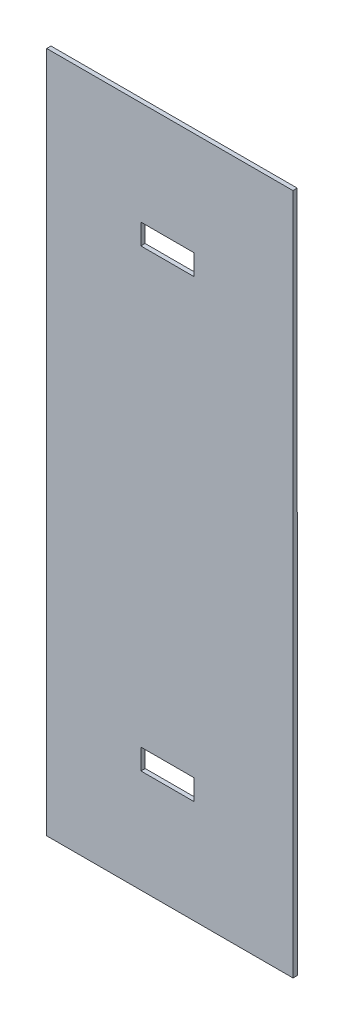
ISO-10303-21;
HEADER;
FILE_DESCRIPTION(('STEP AP214'),'2;1');
FILE_NAME('part.step','',(''),(''),'','','');
FILE_SCHEMA(('AUTOMOTIVE_DESIGN { 1 0 10303 214 1 1 1 1 }'));
ENDSEC;
DATA;
#1=APPLICATION_CONTEXT('core data for automotive mechanical design processes');
#2=APPLICATION_PROTOCOL_DEFINITION('international standard','automotive_design',2000,#1);
#3=PRODUCT_CONTEXT('',#1,'mechanical');
#4=PRODUCT('Part','Part','',(#3));
#5=PRODUCT_RELATED_PRODUCT_CATEGORY('part','',(#4));
#6=PRODUCT_DEFINITION_FORMATION('','',#4);
#7=PRODUCT_DEFINITION_CONTEXT('part definition',#1,'design');
#8=PRODUCT_DEFINITION('design','',#6,#7);
#9=PRODUCT_DEFINITION_SHAPE('','',#8);
#10=(LENGTH_UNIT() NAMED_UNIT(*) SI_UNIT(.MILLI.,.METRE.));
#11=(NAMED_UNIT(*) PLANE_ANGLE_UNIT() SI_UNIT($,.RADIAN.));
#12=(NAMED_UNIT(*) SI_UNIT($,.STERADIAN.) SOLID_ANGLE_UNIT());
#13=UNCERTAINTY_MEASURE_WITH_UNIT(LENGTH_MEASURE(1.E-05),#10,'distance_accuracy_value','');
#14=(GEOMETRIC_REPRESENTATION_CONTEXT(3) GLOBAL_UNCERTAINTY_ASSIGNED_CONTEXT((#13)) GLOBAL_UNIT_ASSIGNED_CONTEXT((#10,
#11,#12)) REPRESENTATION_CONTEXT('',''));
#15=CARTESIAN_POINT('',(0.,0.,0.));
#16=DIRECTION('',(0.,0.,1.));
#17=DIRECTION('',(1.,0.,0.));
#18=AXIS2_PLACEMENT_3D('',#15,#16,#17);
#19=CARTESIAN_POINT('',(884.096921276512,0.718839943507709,3.));
#20=DIRECTION('',(0.999999669452075,0.000813077942697451,0.));
#21=DIRECTION('',(-0.000813077942697451,0.999999669452075,0.));
#22=AXIS2_PLACEMENT_3D('',#19,#20,#21);
#23=PLANE('',#22);
#24=DIRECTION('',(0.000813077942697451,-0.999999669452075,0.));
#25=VECTOR('',#24,1.);
#26=CARTESIAN_POINT('',(884.096921276512,0.718839943507709,0.));
#27=LINE('',#26,#25);
#28=CARTESIAN_POINT('',(882.933248530961,1431.9129479048,0.));
#29=VERTEX_POINT('',#28);
#30=CARTESIAN_POINT('',(882.945057034926,1417.38973992895,0.));
#31=VERTEX_POINT('',#30);
#32=EDGE_CURVE('E174',#29,#31,#27,.T.);
#33=ORIENTED_EDGE('',*,*,#32,.F.);
#34=DIRECTION('',(0.,0.,-1.));
#35=VECTOR('',#34,1.);
#36=CARTESIAN_POINT('',(882.933248530961,1431.9129479048,3.));
#37=LINE('',#36,#35);
#38=CARTESIAN_POINT('',(882.933248530961,1431.9129479048,3.));
#39=VERTEX_POINT('',#38);
#40=EDGE_CURVE('E11',#39,#29,#37,.T.);
#41=ORIENTED_EDGE('',*,*,#40,.F.);
#42=DIRECTION('',(0.000813077942697451,-0.999999669452075,0.));
#43=VECTOR('',#42,1.);
#44=CARTESIAN_POINT('',(884.096921276512,0.718839943507709,3.));
#45=LINE('',#44,#43);
#46=CARTESIAN_POINT('',(882.945057034926,1417.38973992895,3.));
#47=VERTEX_POINT('',#46);
#48=EDGE_CURVE('E147',#39,#47,#45,.T.);
#49=ORIENTED_EDGE('',*,*,#48,.T.);
#50=DIRECTION('',(0.,0.,-1.));
#51=VECTOR('',#50,1.);
#52=CARTESIAN_POINT('',(882.945057034926,1417.38973992895,3.));
#53=LINE('',#52,#51);
#54=EDGE_CURVE('E54',#47,#31,#53,.T.);
#55=ORIENTED_EDGE('',*,*,#54,.T.);
#56=EDGE_LOOP('',(#33,#41,#49,#55));
#57=FACE_BOUND('',#56,.T.);
#58=ADVANCED_FACE('F35',(#57),#23,.T.);
#59=CARTESIAN_POINT('',(-1.16367274556848,1431.19410796128,3.));
#60=DIRECTION('',(0.00081307794270933,-0.999999669452075,0.));
#61=DIRECTION('',(0.999999669452075,0.00081307794270933,0.));
#62=AXIS2_PLACEMENT_3D('',#59,#60,#61);
#63=PLANE('',#62);
#64=DIRECTION('',(-0.999999669452075,-0.00081307794270933,0.));
#65=VECTOR('',#64,1.);
#66=CARTESIAN_POINT('',(-1.16367274556848,1431.19410796128,0.));
#67=LINE('',#66,#65);
#68=CARTESIAN_POINT('',(920.276734997563,1431.94331107999,0.));
#69=VERTEX_POINT('',#68);
#70=EDGE_CURVE('E136',#69,#29,#67,.T.);
#71=ORIENTED_EDGE('',*,*,#70,.F.);
#72=DIRECTION('',(0.,0.,-1.));
#73=VECTOR('',#72,1.);
#74=CARTESIAN_POINT('',(920.276734997563,1431.94331107999,3.));
#75=LINE('',#74,#73);
#76=CARTESIAN_POINT('',(920.276734997563,1431.94331107999,3.));
#77=VERTEX_POINT('',#76);
#78=EDGE_CURVE('E45',#77,#69,#75,.T.);
#79=ORIENTED_EDGE('',*,*,#78,.F.);
#80=DIRECTION('',(-0.999999669452075,-0.00081307794270933,0.));
#81=VECTOR('',#80,1.);
#82=CARTESIAN_POINT('',(-1.16367274556848,1431.19410796128,3.));
#83=LINE('',#82,#81);
#84=EDGE_CURVE('E134',#77,#39,#83,.T.);
#85=ORIENTED_EDGE('',*,*,#84,.T.);
#86=ORIENTED_EDGE('',*,*,#40,.T.);
#87=EDGE_LOOP('',(#71,#79,#85,#86));
#88=FACE_BOUND('',#87,.T.);
#89=ADVANCED_FACE('F133',(#88),#63,.T.);
#90=CARTESIAN_POINT('',(921.440407743125,0.749203118700661,3.));
#91=DIRECTION('',(-0.999999669452075,-0.000813077942705095,0.));
#92=DIRECTION('',(0.000813077942705096,-0.999999669452075,0.));
#93=AXIS2_PLACEMENT_3D('',#90,#91,#92);
#94=PLANE('',#93);
#95=DIRECTION('',(-0.000813077942705096,0.999999669452075,0.));
#96=VECTOR('',#95,1.);
#97=CARTESIAN_POINT('',(921.440407743125,0.749203118700661,0.));
#98=LINE('',#97,#96);
#99=CARTESIAN_POINT('',(920.288543501529,1417.42010310413,0.));
#100=VERTEX_POINT('',#99);
#101=EDGE_CURVE('E177',#100,#69,#98,.T.);
#102=ORIENTED_EDGE('',*,*,#101,.F.);
#103=DIRECTION('',(0.,0.,-1.));
#104=VECTOR('',#103,1.);
#105=CARTESIAN_POINT('',(920.288543501529,1417.42010310413,3.));
#106=LINE('',#105,#104);
#107=CARTESIAN_POINT('',(920.288543501529,1417.42010310413,3.));
#108=VERTEX_POINT('',#107);
#109=EDGE_CURVE('E91',#108,#100,#106,.T.);
#110=ORIENTED_EDGE('',*,*,#109,.F.);
#111=DIRECTION('',(-0.000813077942705096,0.999999669452075,0.));
#112=VECTOR('',#111,1.);
#113=CARTESIAN_POINT('',(921.440407743125,0.749203118700661,3.));
#114=LINE('',#113,#112);
#115=EDGE_CURVE('E146',#108,#77,#114,.T.);
#116=ORIENTED_EDGE('',*,*,#115,.T.);
#117=ORIENTED_EDGE('',*,*,#78,.T.);
#118=EDGE_LOOP('',(#102,#110,#116,#117));
#119=FACE_BOUND('',#118,.T.);
#120=ADVANCED_FACE('F149',(#119),#94,.T.);
#121=CARTESIAN_POINT('',(0.173646304955385,1736.90359044179,3.));
#122=DIRECTION('',(-9.99746359228988E-05,-0.999999995002536,0.));
#123=DIRECTION('',(0.999999995002536,-9.99746359228988E-05,0.));
#124=AXIS2_PLACEMENT_3D('',#121,#122,#123);
#125=PLANE('',#124);
#126=DIRECTION('',(-0.999999995002536,9.99746359228988E-05,0.));
#127=VECTOR('',#126,1.);
#128=CARTESIAN_POINT('',(0.173646304955385,1736.90359044179,0.));
#129=LINE('',#128,#127);
#130=CARTESIAN_POINT('',(920.168033681732,1736.8116143374,0.));
#131=VERTEX_POINT('',#130);
#132=CARTESIAN_POINT('',(882.824535057936,1736.8153477401,0.));
#133=VERTEX_POINT('',#132);
#134=EDGE_CURVE('E165',#131,#133,#129,.T.);
#135=ORIENTED_EDGE('',*,*,#134,.T.);
#136=DIRECTION('',(0.,0.,-1.));
#137=VECTOR('',#136,1.);
#138=CARTESIAN_POINT('',(882.824535057936,1736.8153477401,3.));
#139=LINE('',#138,#137);
#140=CARTESIAN_POINT('',(882.824535057936,1736.8153477401,3.));
#141=VERTEX_POINT('',#140);
#142=EDGE_CURVE('E184',#141,#133,#139,.T.);
#143=ORIENTED_EDGE('',*,*,#142,.F.);
#144=DIRECTION('',(-0.999999995002536,9.99746359228988E-05,0.));
#145=VECTOR('',#144,1.);
#146=CARTESIAN_POINT('',(0.173646304955385,1736.90359044179,3.));
#147=LINE('',#146,#145);
#148=CARTESIAN_POINT('',(920.168033681732,1736.8116143374,3.));
#149=VERTEX_POINT('',#148);
#150=EDGE_CURVE('E223',#149,#141,#147,.T.);
#151=ORIENTED_EDGE('',*,*,#150,.F.);
#152=DIRECTION('',(0.,0.,-1.));
#153=VECTOR('',#152,1.);
#154=CARTESIAN_POINT('',(920.168033681732,1736.8116143374,3.));
#155=LINE('',#154,#153);
#156=EDGE_CURVE('E186',#149,#131,#155,.T.);
#157=ORIENTED_EDGE('',*,*,#156,.T.);
#158=EDGE_LOOP('',(#135,#143,#151,#157));
#159=FACE_BOUND('',#158,.T.);
#160=ADVANCED_FACE('F265',(#159),#125,.F.);
#161=CARTESIAN_POINT('',(882.650888753017,-0.0882427016729173,3.));
#162=DIRECTION('',(-0.999999995002536,9.99746359023037E-05,0.));
#163=DIRECTION('',(-9.99746359023037E-05,-0.999999995002536,0.));
#164=AXIS2_PLACEMENT_3D('',#161,#162,#163);
#165=PLANE('',#164);
#166=DIRECTION('',(9.99746359023037E-05,0.999999995002536,0.));
#167=VECTOR('',#166,1.);
#168=CARTESIAN_POINT('',(882.650888753017,-0.0882427016729173,0.));
#169=LINE('',#168,#167);
#170=CARTESIAN_POINT('',(882.825987010846,1751.33856044399,0.));
#171=VERTEX_POINT('',#170);
#172=EDGE_CURVE('E168',#133,#171,#169,.T.);
#173=ORIENTED_EDGE('',*,*,#172,.T.);
#174=DIRECTION('',(0.,0.,-1.));
#175=VECTOR('',#174,1.);
#176=CARTESIAN_POINT('',(882.825987010846,1751.33856044399,3.));
#177=LINE('',#176,#175);
#178=CARTESIAN_POINT('',(882.825987010846,1751.33856044399,3.));
#179=VERTEX_POINT('',#178);
#180=EDGE_CURVE('E192',#179,#171,#177,.T.);
#181=ORIENTED_EDGE('',*,*,#180,.F.);
#182=DIRECTION('',(9.99746359023037E-05,0.999999995002536,0.));
#183=VECTOR('',#182,1.);
#184=CARTESIAN_POINT('',(882.650888753017,-0.0882427016729173,3.));
#185=LINE('',#184,#183);
#186=EDGE_CURVE('E227',#141,#179,#185,.T.);
#187=ORIENTED_EDGE('',*,*,#186,.F.);
#188=ORIENTED_EDGE('',*,*,#142,.T.);
#189=EDGE_LOOP('',(#173,#181,#187,#188));
#190=FACE_BOUND('',#189,.T.);
#191=ADVANCED_FACE('F261',(#190),#165,.F.);
#192=CARTESIAN_POINT('',(0.175098257865142,1751.42680314568,3.));
#193=DIRECTION('',(9.99746359228982E-05,0.999999995002536,0.));
#194=DIRECTION('',(-0.999999995002536,9.99746359228982E-05,0.));
#195=AXIS2_PLACEMENT_3D('',#192,#193,#194);
#196=PLANE('',#195);
#197=DIRECTION('',(0.999999995002536,-9.99746359228982E-05,0.));
#198=VECTOR('',#197,1.);
#199=CARTESIAN_POINT('',(0.175098257865142,1751.42680314568,0.));
#200=LINE('',#199,#198);
#201=CARTESIAN_POINT('',(920.169485634641,1751.33482704129,0.));
#202=VERTEX_POINT('',#201);
#203=EDGE_CURVE('E170',#171,#202,#200,.T.);
#204=ORIENTED_EDGE('',*,*,#203,.T.);
#205=DIRECTION('',(0.,0.,-1.));
#206=VECTOR('',#205,1.);
#207=CARTESIAN_POINT('',(920.169485634641,1751.33482704129,3.));
#208=LINE('',#207,#206);
#209=CARTESIAN_POINT('',(920.169485634641,1751.33482704129,3.));
#210=VERTEX_POINT('',#209);
#211=EDGE_CURVE('E189',#210,#202,#208,.T.);
#212=ORIENTED_EDGE('',*,*,#211,.F.);
#213=DIRECTION('',(0.999999995002536,-9.99746359228982E-05,0.));
#214=VECTOR('',#213,1.);
#215=CARTESIAN_POINT('',(0.175098257865142,1751.42680314568,3.));
#216=LINE('',#215,#214);
#217=EDGE_CURVE('E233',#179,#210,#216,.T.);
#218=ORIENTED_EDGE('',*,*,#217,.F.);
#219=ORIENTED_EDGE('',*,*,#180,.T.);
#220=EDGE_LOOP('',(#204,#212,#218,#219));
#221=FACE_BOUND('',#220,.T.);
#222=ADVANCED_FACE('F258',(#221),#196,.F.);
#223=CARTESIAN_POINT('',(816.713281448013,0.,3.));
#224=DIRECTION('',(1.,0.,0.));
#225=DIRECTION('',(0.,0.,-1.));
#226=AXIS2_PLACEMENT_3D('',#223,#224,#225);
#227=PLANE('',#226);
#228=DIRECTION('',(0.,-1.,0.));
#229=VECTOR('',#228,1.);
#230=CARTESIAN_POINT('',(816.713281448013,0.,0.));
#231=LINE('',#230,#229);
#232=CARTESIAN_POINT('',(816.713281448013,1823.87268836959,0.));
#233=VERTEX_POINT('',#232);
#234=CARTESIAN_POINT('',(816.713281448013,1344.80842435186,0.));
#235=VERTEX_POINT('',#234);
#236=EDGE_CURVE('E156',#233,#235,#231,.T.);
#237=ORIENTED_EDGE('',*,*,#236,.T.);
#238=DIRECTION('',(0.,0.,-1.));
#239=VECTOR('',#238,1.);
#240=CARTESIAN_POINT('',(816.713281448013,1344.80842435186,3.));
#241=LINE('',#240,#239);
#242=CARTESIAN_POINT('',(816.713281448013,1344.80842435186,3.));
#243=VERTEX_POINT('',#242);
#244=EDGE_CURVE('E39',#243,#235,#241,.T.);
#245=ORIENTED_EDGE('',*,*,#244,.F.);
#246=DIRECTION('',(0.,-1.,0.));
#247=VECTOR('',#246,1.);
#248=CARTESIAN_POINT('',(816.713281448013,0.,3.));
#249=LINE('',#248,#247);
#250=CARTESIAN_POINT('',(816.713281448013,1823.87268836959,3.));
#251=VERTEX_POINT('',#250);
#252=EDGE_CURVE('E182',#251,#243,#249,.T.);
#253=ORIENTED_EDGE('',*,*,#252,.F.);
#254=DIRECTION('',(0.,0.,-1.));
#255=VECTOR('',#254,1.);
#256=CARTESIAN_POINT('',(816.713281448013,1823.87268836959,3.));
#257=LINE('',#256,#255);
#258=EDGE_CURVE('E152',#251,#233,#257,.T.);
#259=ORIENTED_EDGE('',*,*,#258,.T.);
#260=EDGE_LOOP('',(#237,#245,#253,#259));
#261=FACE_BOUND('',#260,.T.);
#262=ADVANCED_FACE('F37',(#261),#227,.F.);
#263=CARTESIAN_POINT('',(-0.47930420952707,1344.51710500394,3.));
#264=DIRECTION('',(-0.000356487974223129,0.99999993645816,0.));
#265=DIRECTION('',(-0.99999993645816,-0.000356487974223129,0.));
#266=AXIS2_PLACEMENT_3D('',#263,#264,#265);
#267=PLANE('',#266);
#268=DIRECTION('',(0.99999993645816,0.000356487974223129,0.));
#269=VECTOR('',#268,1.);
#270=CARTESIAN_POINT('',(-0.47930420952707,1344.51710500394,0.));
#271=LINE('',#270,#269);
#272=CARTESIAN_POINT('',(989.79440542738,1344.87012569504,0.));
#273=VERTEX_POINT('',#272);
#274=EDGE_CURVE('E159',#235,#273,#271,.T.);
#275=ORIENTED_EDGE('',*,*,#274,.T.);
#276=DIRECTION('',(0.,0.,-1.));
#277=VECTOR('',#276,1.);
#278=CARTESIAN_POINT('',(989.79440542738,1344.87012569504,3.));
#279=LINE('',#278,#277);
#280=CARTESIAN_POINT('',(989.79440542738,1344.87012569504,3.));
#281=VERTEX_POINT('',#280);
#282=EDGE_CURVE('E201',#281,#273,#279,.T.);
#283=ORIENTED_EDGE('',*,*,#282,.F.);
#284=DIRECTION('',(0.99999993645816,0.000356487974223129,0.));
#285=VECTOR('',#284,1.);
#286=CARTESIAN_POINT('',(-0.47930420952707,1344.51710500394,3.));
#287=LINE('',#286,#285);
#288=EDGE_CURVE('E104',#243,#281,#287,.T.);
#289=ORIENTED_EDGE('',*,*,#288,.F.);
#290=ORIENTED_EDGE('',*,*,#244,.T.);
#291=EDGE_LOOP('',(#275,#283,#289,#290));
#292=FACE_BOUND('',#291,.T.);
#293=ADVANCED_FACE('F207',(#292),#267,.F.);
#294=CARTESIAN_POINT('',(990.022115206111,0.167648770386769,3.));
#295=DIRECTION('',(-0.999999985662252,-0.000169338407100291,0.));
#296=DIRECTION('',(0.000169338407100291,-0.999999985662252,0.));
#297=AXIS2_PLACEMENT_3D('',#294,#295,#296);
#298=PLANE('',#297);
#299=DIRECTION('',(-0.000169338407100291,0.999999985662252,0.));
#300=VECTOR('',#299,1.);
#301=CARTESIAN_POINT('',(990.022115206111,0.167648770386769,0.));
#302=LINE('',#301,#300);
#303=CARTESIAN_POINT('',(989.713281448013,1823.93438284408,0.));
#304=VERTEX_POINT('',#303);
#305=EDGE_CURVE('E161',#273,#304,#302,.T.);
#306=ORIENTED_EDGE('',*,*,#305,.T.);
#307=DIRECTION('',(0.,0.,-1.));
#308=VECTOR('',#307,1.);
#309=CARTESIAN_POINT('',(989.713281448013,1823.93438284408,3.));
#310=LINE('',#309,#308);
#311=CARTESIAN_POINT('',(989.713281448013,1823.93438284408,3.));
#312=VERTEX_POINT('',#311);
#313=EDGE_CURVE('E199',#312,#304,#310,.T.);
#314=ORIENTED_EDGE('',*,*,#313,.F.);
#315=DIRECTION('',(-0.000169338407100291,0.999999985662252,0.));
#316=VECTOR('',#315,1.);
#317=CARTESIAN_POINT('',(990.022115206111,0.167648770386769,3.));
#318=LINE('',#317,#316);
#319=EDGE_CURVE('E224',#281,#312,#318,.T.);
#320=ORIENTED_EDGE('',*,*,#319,.F.);
#321=ORIENTED_EDGE('',*,*,#282,.T.);
#322=EDGE_LOOP('',(#306,#314,#320,#321));
#323=FACE_BOUND('',#322,.T.);
#324=ADVANCED_FACE('F217',(#323),#298,.F.);
#325=CARTESIAN_POINT('',(919.994387376786,-0.0919761043838701,3.));
#326=DIRECTION('',(0.999999995002536,-9.99746359175926E-05,0.));
#327=DIRECTION('',(9.99746359175927E-05,0.999999995002536,0.));
#328=AXIS2_PLACEMENT_3D('',#325,#326,#327);
#329=PLANE('',#328);
#330=DIRECTION('',(-9.99746359175927E-05,-0.999999995002536,0.));
#331=VECTOR('',#330,1.);
#332=CARTESIAN_POINT('',(919.994387376786,-0.0919761043838701,0.));
#333=LINE('',#332,#331);
#334=EDGE_CURVE('E172',#202,#131,#333,.T.);
#335=ORIENTED_EDGE('',*,*,#334,.T.);
#336=ORIENTED_EDGE('',*,*,#156,.F.);
#337=DIRECTION('',(-9.99746359175927E-05,-0.999999995002536,0.));
#338=VECTOR('',#337,1.);
#339=CARTESIAN_POINT('',(919.994387376786,-0.0919761043838701,3.));
#340=LINE('',#339,#338);
#341=EDGE_CURVE('E235',#210,#149,#340,.T.);
#342=ORIENTED_EDGE('',*,*,#341,.F.);
#343=ORIENTED_EDGE('',*,*,#211,.T.);
#344=EDGE_LOOP('',(#335,#336,#342,#343));
#345=FACE_BOUND('',#344,.T.);
#346=ADVANCED_FACE('F244',(#345),#329,.F.);
#347=CARTESIAN_POINT('',(-0.650317248829411,1823.58120387432,3.));
#348=DIRECTION('',(0.000356615436754808,-0.999999936412713,0.));
#349=DIRECTION('',(0.999999936412713,0.000356615436754809,0.));
#350=AXIS2_PLACEMENT_3D('',#347,#348,#349);
#351=PLANE('',#350);
#352=DIRECTION('',(-0.999999936412713,-0.000356615436754809,0.));
#353=VECTOR('',#352,1.);
#354=CARTESIAN_POINT('',(-0.650317248829411,1823.58120387432,0.));
#355=LINE('',#354,#353);
#356=EDGE_CURVE('E163',#304,#233,#355,.T.);
#357=ORIENTED_EDGE('',*,*,#356,.T.);
#358=ORIENTED_EDGE('',*,*,#258,.F.);
#359=DIRECTION('',(-0.999999936412713,-0.000356615436754809,0.));
#360=VECTOR('',#359,1.);
#361=CARTESIAN_POINT('',(-0.650317248829411,1823.58120387432,3.));
#362=LINE('',#361,#360);
#363=EDGE_CURVE('E221',#312,#251,#362,.T.);
#364=ORIENTED_EDGE('',*,*,#363,.F.);
#365=ORIENTED_EDGE('',*,*,#313,.T.);
#366=EDGE_LOOP('',(#357,#358,#364,#365));
#367=FACE_BOUND('',#366,.T.);
#368=ADVANCED_FACE('F220',(#367),#351,.F.);
#369=CARTESIAN_POINT('',(-1.15186424160266,1416.67089998543,3.));
#370=DIRECTION('',(-0.000813077942709328,0.999999669452075,0.));
#371=DIRECTION('',(-0.999999669452075,-0.000813077942709328,0.));
#372=AXIS2_PLACEMENT_3D('',#369,#370,#371);
#373=PLANE('',#372);
#374=DIRECTION('',(0.999999669452075,0.000813077942709328,0.));
#375=VECTOR('',#374,1.);
#376=CARTESIAN_POINT('',(-1.15186424160266,1416.67089998543,0.));
#377=LINE('',#376,#375);
#378=EDGE_CURVE('E179',#31,#100,#377,.T.);
#379=ORIENTED_EDGE('',*,*,#378,.F.);
#380=ORIENTED_EDGE('',*,*,#54,.F.);
#381=DIRECTION('',(0.999999669452075,0.000813077942709328,0.));
#382=VECTOR('',#381,1.);
#383=CARTESIAN_POINT('',(-1.15186424160266,1416.67089998543,3.));
#384=LINE('',#383,#382);
#385=EDGE_CURVE('E150',#47,#108,#384,.T.);
#386=ORIENTED_EDGE('',*,*,#385,.T.);
#387=ORIENTED_EDGE('',*,*,#109,.T.);
#388=EDGE_LOOP('',(#379,#380,#386,#387));
#389=FACE_BOUND('',#388,.T.);
#390=ADVANCED_FACE('F236',(#389),#373,.T.);
#391=CARTESIAN_POINT('',(0.,0.,3.));
#392=DIRECTION('',(0.,0.,1.));
#393=DIRECTION('',(1.,0.,0.));
#394=AXIS2_PLACEMENT_3D('',#391,#392,#393);
#395=PLANE('',#394);
#396=ORIENTED_EDGE('',*,*,#252,.T.);
#397=ORIENTED_EDGE('',*,*,#288,.T.);
#398=ORIENTED_EDGE('',*,*,#319,.T.);
#399=ORIENTED_EDGE('',*,*,#363,.T.);
#400=EDGE_LOOP('',(#396,#397,#398,#399));
#401=FACE_BOUND('',#400,.T.);
#402=ORIENTED_EDGE('',*,*,#150,.T.);
#403=ORIENTED_EDGE('',*,*,#186,.T.);
#404=ORIENTED_EDGE('',*,*,#217,.T.);
#405=ORIENTED_EDGE('',*,*,#341,.T.);
#406=EDGE_LOOP('',(#402,#403,#404,#405));
#407=FACE_BOUND('',#406,.T.);
#408=ORIENTED_EDGE('',*,*,#48,.F.);
#409=ORIENTED_EDGE('',*,*,#84,.F.);
#410=ORIENTED_EDGE('',*,*,#115,.F.);
#411=ORIENTED_EDGE('',*,*,#385,.F.);
#412=EDGE_LOOP('',(#408,#409,#410,#411));
#413=FACE_BOUND('',#412,.T.);
#414=ADVANCED_FACE('F144',(#401,#407,#413),#395,.T.);
#415=CARTESIAN_POINT('',(0.,0.,0.));
#416=DIRECTION('',(0.,0.,1.));
#417=DIRECTION('',(1.,0.,0.));
#418=AXIS2_PLACEMENT_3D('',#415,#416,#417);
#419=PLANE('',#418);
#420=ORIENTED_EDGE('',*,*,#236,.F.);
#421=ORIENTED_EDGE('',*,*,#356,.F.);
#422=ORIENTED_EDGE('',*,*,#305,.F.);
#423=ORIENTED_EDGE('',*,*,#274,.F.);
#424=EDGE_LOOP('',(#420,#421,#422,#423));
#425=FACE_BOUND('',#424,.T.);
#426=ORIENTED_EDGE('',*,*,#134,.F.);
#427=ORIENTED_EDGE('',*,*,#334,.F.);
#428=ORIENTED_EDGE('',*,*,#203,.F.);
#429=ORIENTED_EDGE('',*,*,#172,.F.);
#430=EDGE_LOOP('',(#426,#427,#428,#429));
#431=FACE_BOUND('',#430,.T.);
#432=ORIENTED_EDGE('',*,*,#32,.T.);
#433=ORIENTED_EDGE('',*,*,#378,.T.);
#434=ORIENTED_EDGE('',*,*,#101,.T.);
#435=ORIENTED_EDGE('',*,*,#70,.T.);
#436=EDGE_LOOP('',(#432,#433,#434,#435));
#437=FACE_BOUND('',#436,.T.);
#438=ADVANCED_FACE('F214',(#425,#431,#437),#419,.F.);
#439=CLOSED_SHELL('',(#58,#89,#120,#160,#191,#222,#262,#293,#324,#346,#368,#390,#414,#438));
#440=MANIFOLD_SOLID_BREP('B2',#439);
#441=ADVANCED_BREP_SHAPE_REPRESENTATION('',(#18,#440),#14);
#442=SHAPE_DEFINITION_REPRESENTATION(#9,#441);
ENDSEC;
END-ISO-10303-21;
